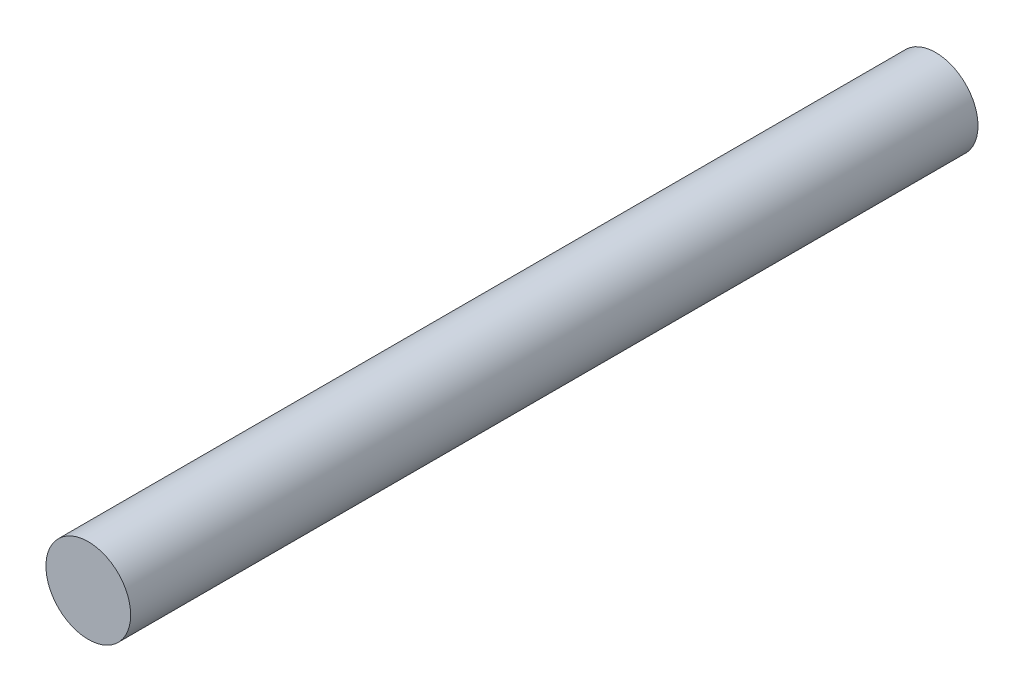
ISO-10303-21;
HEADER;
FILE_DESCRIPTION(('STEP AP214'),'2;1');
FILE_NAME('part.step','',(''),(''),'','','');
FILE_SCHEMA(('AUTOMOTIVE_DESIGN { 1 0 10303 214 1 1 1 1 }'));
ENDSEC;
DATA;
#1=APPLICATION_CONTEXT('core data for automotive mechanical design processes');
#2=APPLICATION_PROTOCOL_DEFINITION('international standard','automotive_design',2000,#1);
#3=PRODUCT_CONTEXT('',#1,'mechanical');
#4=PRODUCT('Part','Part','',(#3));
#5=PRODUCT_RELATED_PRODUCT_CATEGORY('part','',(#4));
#6=PRODUCT_DEFINITION_FORMATION('','',#4);
#7=PRODUCT_DEFINITION_CONTEXT('part definition',#1,'design');
#8=PRODUCT_DEFINITION('design','',#6,#7);
#9=PRODUCT_DEFINITION_SHAPE('','',#8);
#10=(LENGTH_UNIT() NAMED_UNIT(*) SI_UNIT(.MILLI.,.METRE.));
#11=(NAMED_UNIT(*) PLANE_ANGLE_UNIT() SI_UNIT($,.RADIAN.));
#12=(NAMED_UNIT(*) SI_UNIT($,.STERADIAN.) SOLID_ANGLE_UNIT());
#13=UNCERTAINTY_MEASURE_WITH_UNIT(LENGTH_MEASURE(1.E-05),#10,'distance_accuracy_value','');
#14=(GEOMETRIC_REPRESENTATION_CONTEXT(3) GLOBAL_UNCERTAINTY_ASSIGNED_CONTEXT((#13)) GLOBAL_UNIT_ASSIGNED_CONTEXT((#10,
#11,#12)) REPRESENTATION_CONTEXT('',''));
#15=CARTESIAN_POINT('',(0.,0.,0.));
#16=DIRECTION('',(0.,0.,1.));
#17=DIRECTION('',(1.,0.,0.));
#18=AXIS2_PLACEMENT_3D('',#15,#16,#17);
#19=CARTESIAN_POINT('',(0.,0.,50.));
#20=DIRECTION('',(0.,0.,-1.));
#21=DIRECTION('',(-1.,0.,0.));
#22=AXIS2_PLACEMENT_3D('',#19,#20,#21);
#23=CYLINDRICAL_SURFACE('',#22,2.5);
#24=CARTESIAN_POINT('',(0.,0.,50.));
#25=DIRECTION('',(0.,0.,1.));
#26=DIRECTION('',(1.,0.,0.));
#27=AXIS2_PLACEMENT_3D('',#24,#25,#26);
#28=CIRCLE('',#27,2.5);
#29=CARTESIAN_POINT('',(2.5,0.,50.));
#30=VERTEX_POINT('',#29);
#31=EDGE_CURVE('E10',#30,#30,#28,.T.);
#32=ORIENTED_EDGE('',*,*,#31,.F.);
#33=EDGE_LOOP('',(#32));
#34=FACE_BOUND('',#33,.T.);
#35=CARTESIAN_POINT('',(0.,0.,0.));
#36=DIRECTION('',(0.,0.,1.));
#37=DIRECTION('',(1.,0.,0.));
#38=AXIS2_PLACEMENT_3D('',#35,#36,#37);
#39=CIRCLE('',#38,2.5);
#40=CARTESIAN_POINT('',(2.5,0.,0.));
#41=VERTEX_POINT('',#40);
#42=EDGE_CURVE('E34',#41,#41,#39,.T.);
#43=ORIENTED_EDGE('',*,*,#42,.T.);
#44=EDGE_LOOP('',(#43));
#45=FACE_BOUND('',#44,.T.);
#46=ADVANCED_FACE('F31',(#34,#45),#23,.T.);
#47=CARTESIAN_POINT('',(0.,0.,50.));
#48=DIRECTION('',(0.,0.,1.));
#49=DIRECTION('',(1.,0.,0.));
#50=AXIS2_PLACEMENT_3D('',#47,#48,#49);
#51=PLANE('',#50);
#52=ORIENTED_EDGE('',*,*,#31,.T.);
#53=EDGE_LOOP('',(#52));
#54=FACE_BOUND('',#53,.T.);
#55=ADVANCED_FACE('F46',(#54),#51,.T.);
#56=CARTESIAN_POINT('',(0.,0.,0.));
#57=DIRECTION('',(0.,0.,1.));
#58=DIRECTION('',(1.,0.,0.));
#59=AXIS2_PLACEMENT_3D('',#56,#57,#58);
#60=PLANE('',#59);
#61=ORIENTED_EDGE('',*,*,#42,.F.);
#62=EDGE_LOOP('',(#61));
#63=FACE_BOUND('',#62,.T.);
#64=ADVANCED_FACE('F44',(#63),#60,.F.);
#65=CLOSED_SHELL('',(#46,#55,#64));
#66=MANIFOLD_SOLID_BREP('B2',#65);
#67=ADVANCED_BREP_SHAPE_REPRESENTATION('',(#18,#66),#14);
#68=SHAPE_DEFINITION_REPRESENTATION(#9,#67);
ENDSEC;
END-ISO-10303-21;
